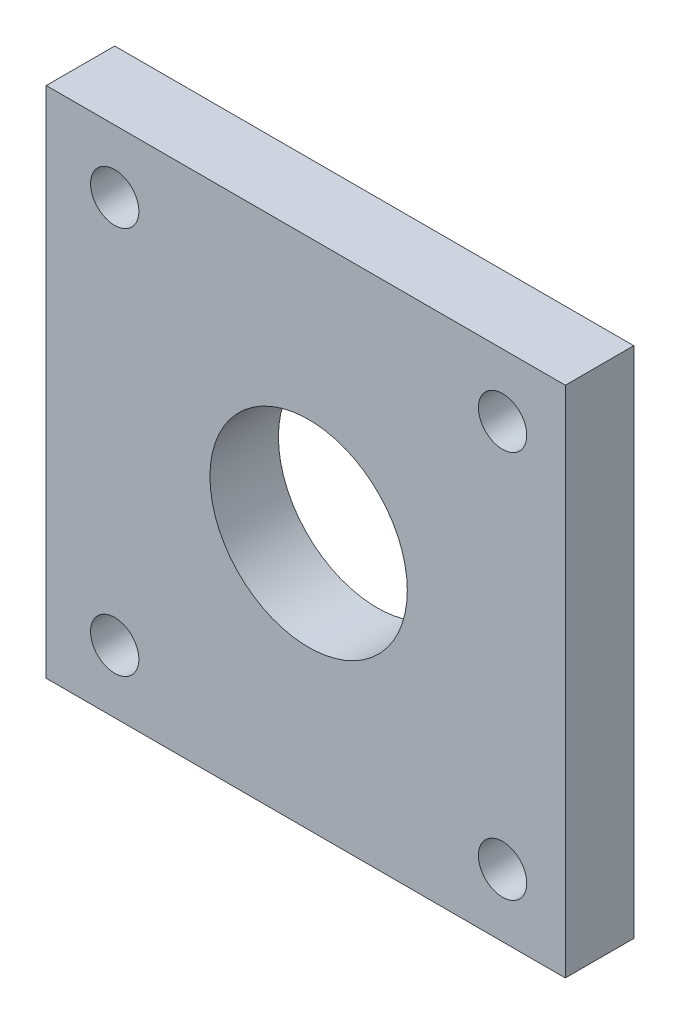
ISO-10303-21;
HEADER;
FILE_DESCRIPTION(('STEP AP214'),'2;1');
FILE_NAME('part.step','',(''),(''),'','','');
FILE_SCHEMA(('AUTOMOTIVE_DESIGN { 1 0 10303 214 1 1 1 1 }'));
ENDSEC;
DATA;
#1=APPLICATION_CONTEXT('core data for automotive mechanical design processes');
#2=APPLICATION_PROTOCOL_DEFINITION('international standard','automotive_design',2000,#1);
#3=PRODUCT_CONTEXT('',#1,'mechanical');
#4=PRODUCT('Part','Part','',(#3));
#5=PRODUCT_RELATED_PRODUCT_CATEGORY('part','',(#4));
#6=PRODUCT_DEFINITION_FORMATION('','',#4);
#7=PRODUCT_DEFINITION_CONTEXT('part definition',#1,'design');
#8=PRODUCT_DEFINITION('design','',#6,#7);
#9=PRODUCT_DEFINITION_SHAPE('','',#8);
#10=(LENGTH_UNIT() NAMED_UNIT(*) SI_UNIT(.MILLI.,.METRE.));
#11=(NAMED_UNIT(*) PLANE_ANGLE_UNIT() SI_UNIT($,.RADIAN.));
#12=(NAMED_UNIT(*) SI_UNIT($,.STERADIAN.) SOLID_ANGLE_UNIT());
#13=UNCERTAINTY_MEASURE_WITH_UNIT(LENGTH_MEASURE(1.E-05),#10,'distance_accuracy_value','');
#14=(GEOMETRIC_REPRESENTATION_CONTEXT(3) GLOBAL_UNCERTAINTY_ASSIGNED_CONTEXT((#13)) GLOBAL_UNIT_ASSIGNED_CONTEXT((#10,
#11,#12)) REPRESENTATION_CONTEXT('',''));
#15=CARTESIAN_POINT('',(0.,0.,0.));
#16=DIRECTION('',(0.,0.,1.));
#17=DIRECTION('',(1.,0.,0.));
#18=AXIS2_PLACEMENT_3D('',#15,#16,#17);
#19=CARTESIAN_POINT('',(0.,0.,6.));
#20=DIRECTION('',(0.,0.,1.));
#21=DIRECTION('',(1.,0.,0.));
#22=AXIS2_PLACEMENT_3D('',#19,#20,#21);
#23=PLANE('',#22);
#24=CARTESIAN_POINT('',(17.,-17.,6.));
#25=DIRECTION('',(0.,0.,1.));
#26=DIRECTION('',(1.,0.,0.));
#27=AXIS2_PLACEMENT_3D('',#24,#25,#26);
#28=CIRCLE('',#27,2.12);
#29=CARTESIAN_POINT('',(19.12,-17.,6.));
#30=VERTEX_POINT('',#29);
#31=EDGE_CURVE('E133',#30,#30,#28,.T.);
#32=ORIENTED_EDGE('',*,*,#31,.F.);
#33=EDGE_LOOP('',(#32));
#34=FACE_BOUND('',#33,.T.);
#35=CARTESIAN_POINT('',(-17.,-17.,6.));
#36=DIRECTION('',(0.,0.,1.));
#37=DIRECTION('',(1.,0.,0.));
#38=AXIS2_PLACEMENT_3D('',#35,#36,#37);
#39=CIRCLE('',#38,2.12);
#40=CARTESIAN_POINT('',(-14.88,-17.,6.));
#41=VERTEX_POINT('',#40);
#42=EDGE_CURVE('E122',#41,#41,#39,.T.);
#43=ORIENTED_EDGE('',*,*,#42,.F.);
#44=EDGE_LOOP('',(#43));
#45=FACE_BOUND('',#44,.T.);
#46=DIRECTION('',(0.,-1.,0.));
#47=VECTOR('',#46,1.);
#48=CARTESIAN_POINT('',(-23.,22.5,6.));
#49=LINE('',#48,#47);
#50=CARTESIAN_POINT('',(-23.,22.5,6.));
#51=VERTEX_POINT('',#50);
#52=CARTESIAN_POINT('',(-23.,-22.5,6.));
#53=VERTEX_POINT('',#52);
#54=EDGE_CURVE('E92',#51,#53,#49,.T.);
#55=ORIENTED_EDGE('',*,*,#54,.T.);
#56=DIRECTION('',(1.,0.,0.));
#57=VECTOR('',#56,1.);
#58=CARTESIAN_POINT('',(-23.,-22.5,6.));
#59=LINE('',#58,#57);
#60=CARTESIAN_POINT('',(22.5,-22.5,6.));
#61=VERTEX_POINT('',#60);
#62=EDGE_CURVE('E86',#53,#61,#59,.T.);
#63=ORIENTED_EDGE('',*,*,#62,.T.);
#64=DIRECTION('',(0.,1.,0.));
#65=VECTOR('',#64,1.);
#66=CARTESIAN_POINT('',(22.5,-22.5,6.));
#67=LINE('',#66,#65);
#68=CARTESIAN_POINT('',(22.5,22.5,6.));
#69=VERTEX_POINT('',#68);
#70=EDGE_CURVE('E87',#61,#69,#67,.T.);
#71=ORIENTED_EDGE('',*,*,#70,.T.);
#72=DIRECTION('',(-1.,0.,0.));
#73=VECTOR('',#72,1.);
#74=CARTESIAN_POINT('',(22.5,22.5,6.));
#75=LINE('',#74,#73);
#76=EDGE_CURVE('E57',#69,#51,#75,.T.);
#77=ORIENTED_EDGE('',*,*,#76,.T.);
#78=EDGE_LOOP('',(#55,#63,#71,#77));
#79=FACE_BOUND('',#78,.T.);
#80=CARTESIAN_POINT('',(0.,0.,6.));
#81=DIRECTION('',(0.,0.,1.));
#82=DIRECTION('',(1.,0.,0.));
#83=AXIS2_PLACEMENT_3D('',#80,#81,#82);
#84=CIRCLE('',#83,8.65);
#85=CARTESIAN_POINT('',(8.65,0.,6.));
#86=VERTEX_POINT('',#85);
#87=EDGE_CURVE('E106',#86,#86,#84,.T.);
#88=ORIENTED_EDGE('',*,*,#87,.F.);
#89=EDGE_LOOP('',(#88));
#90=FACE_BOUND('',#89,.T.);
#91=CARTESIAN_POINT('',(-17.,17.,6.));
#92=DIRECTION('',(0.,0.,1.));
#93=DIRECTION('',(1.,0.,0.));
#94=AXIS2_PLACEMENT_3D('',#91,#92,#93);
#95=CIRCLE('',#94,2.12);
#96=CARTESIAN_POINT('',(-14.88,17.,6.));
#97=VERTEX_POINT('',#96);
#98=EDGE_CURVE('E127',#97,#97,#95,.T.);
#99=ORIENTED_EDGE('',*,*,#98,.F.);
#100=EDGE_LOOP('',(#99));
#101=FACE_BOUND('',#100,.T.);
#102=CARTESIAN_POINT('',(17.,17.,6.));
#103=DIRECTION('',(0.,0.,1.));
#104=DIRECTION('',(1.,0.,0.));
#105=AXIS2_PLACEMENT_3D('',#102,#103,#104);
#106=CIRCLE('',#105,2.12);
#107=CARTESIAN_POINT('',(19.12,17.,6.));
#108=VERTEX_POINT('',#107);
#109=EDGE_CURVE('E136',#108,#108,#106,.T.);
#110=ORIENTED_EDGE('',*,*,#109,.F.);
#111=EDGE_LOOP('',(#110));
#112=FACE_BOUND('',#111,.T.);
#113=ADVANCED_FACE('F39',(#34,#45,#79,#90,#101,#112),#23,.T.);
#114=CARTESIAN_POINT('',(0.,0.,0.));
#115=DIRECTION('',(0.,0.,1.));
#116=DIRECTION('',(1.,0.,0.));
#117=AXIS2_PLACEMENT_3D('',#114,#115,#116);
#118=PLANE('',#117);
#119=DIRECTION('',(0.,-1.,0.));
#120=VECTOR('',#119,1.);
#121=CARTESIAN_POINT('',(-23.,22.5,0.));
#122=LINE('',#121,#120);
#123=CARTESIAN_POINT('',(-23.,22.5,0.));
#124=VERTEX_POINT('',#123);
#125=CARTESIAN_POINT('',(-23.,-22.5,0.));
#126=VERTEX_POINT('',#125);
#127=EDGE_CURVE('E101',#124,#126,#122,.T.);
#128=ORIENTED_EDGE('',*,*,#127,.F.);
#129=DIRECTION('',(-1.,0.,0.));
#130=VECTOR('',#129,1.);
#131=CARTESIAN_POINT('',(22.5,22.5,0.));
#132=LINE('',#131,#130);
#133=CARTESIAN_POINT('',(22.5,22.5,0.));
#134=VERTEX_POINT('',#133);
#135=EDGE_CURVE('E79',#134,#124,#132,.T.);
#136=ORIENTED_EDGE('',*,*,#135,.F.);
#137=DIRECTION('',(0.,1.,0.));
#138=VECTOR('',#137,1.);
#139=CARTESIAN_POINT('',(22.5,-22.5,0.));
#140=LINE('',#139,#138);
#141=CARTESIAN_POINT('',(22.5,-22.5,0.));
#142=VERTEX_POINT('',#141);
#143=EDGE_CURVE('E74',#142,#134,#140,.T.);
#144=ORIENTED_EDGE('',*,*,#143,.F.);
#145=DIRECTION('',(1.,0.,0.));
#146=VECTOR('',#145,1.);
#147=CARTESIAN_POINT('',(-23.,-22.5,0.));
#148=LINE('',#147,#146);
#149=EDGE_CURVE('E93',#126,#142,#148,.T.);
#150=ORIENTED_EDGE('',*,*,#149,.F.);
#151=EDGE_LOOP('',(#128,#136,#144,#150));
#152=FACE_BOUND('',#151,.T.);
#153=CARTESIAN_POINT('',(0.,0.,0.));
#154=DIRECTION('',(0.,0.,1.));
#155=DIRECTION('',(1.,0.,0.));
#156=AXIS2_PLACEMENT_3D('',#153,#154,#155);
#157=CIRCLE('',#156,8.65);
#158=CARTESIAN_POINT('',(8.65,0.,0.));
#159=VERTEX_POINT('',#158);
#160=EDGE_CURVE('E117',#159,#159,#157,.T.);
#161=ORIENTED_EDGE('',*,*,#160,.T.);
#162=EDGE_LOOP('',(#161));
#163=FACE_BOUND('',#162,.T.);
#164=CARTESIAN_POINT('',(-17.,-17.,0.));
#165=DIRECTION('',(0.,0.,1.));
#166=DIRECTION('',(1.,0.,0.));
#167=AXIS2_PLACEMENT_3D('',#164,#165,#166);
#168=CIRCLE('',#167,2.12);
#169=CARTESIAN_POINT('',(-14.88,-17.,0.));
#170=VERTEX_POINT('',#169);
#171=EDGE_CURVE('E121',#170,#170,#168,.T.);
#172=ORIENTED_EDGE('',*,*,#171,.T.);
#173=EDGE_LOOP('',(#172));
#174=FACE_BOUND('',#173,.T.);
#175=CARTESIAN_POINT('',(-17.,17.,0.));
#176=DIRECTION('',(0.,0.,1.));
#177=DIRECTION('',(1.,0.,0.));
#178=AXIS2_PLACEMENT_3D('',#175,#176,#177);
#179=CIRCLE('',#178,2.12);
#180=CARTESIAN_POINT('',(-14.88,17.,0.));
#181=VERTEX_POINT('',#180);
#182=EDGE_CURVE('E130',#181,#181,#179,.T.);
#183=ORIENTED_EDGE('',*,*,#182,.T.);
#184=EDGE_LOOP('',(#183));
#185=FACE_BOUND('',#184,.T.);
#186=CARTESIAN_POINT('',(17.,-17.,0.));
#187=DIRECTION('',(0.,0.,1.));
#188=DIRECTION('',(1.,0.,0.));
#189=AXIS2_PLACEMENT_3D('',#186,#187,#188);
#190=CIRCLE('',#189,2.12);
#191=CARTESIAN_POINT('',(19.12,-17.,0.));
#192=VERTEX_POINT('',#191);
#193=EDGE_CURVE('E137',#192,#192,#190,.T.);
#194=ORIENTED_EDGE('',*,*,#193,.T.);
#195=EDGE_LOOP('',(#194));
#196=FACE_BOUND('',#195,.T.);
#197=CARTESIAN_POINT('',(17.,17.,0.));
#198=DIRECTION('',(0.,0.,1.));
#199=DIRECTION('',(1.,0.,0.));
#200=AXIS2_PLACEMENT_3D('',#197,#198,#199);
#201=CIRCLE('',#200,2.12);
#202=CARTESIAN_POINT('',(19.12,17.,0.));
#203=VERTEX_POINT('',#202);
#204=EDGE_CURVE('E145',#203,#203,#201,.T.);
#205=ORIENTED_EDGE('',*,*,#204,.T.);
#206=EDGE_LOOP('',(#205));
#207=FACE_BOUND('',#206,.T.);
#208=ADVANCED_FACE('F112',(#152,#163,#174,#185,#196,#207),#118,.F.);
#209=CARTESIAN_POINT('',(-23.,22.5,6.));
#210=DIRECTION('',(1.,0.,0.));
#211=DIRECTION('',(0.,0.,-1.));
#212=AXIS2_PLACEMENT_3D('',#209,#210,#211);
#213=PLANE('',#212);
#214=CARTESIAN_POINT('',(-23.,-9.,3.));
#215=DIRECTION('',(1.,0.,0.));
#216=DIRECTION('',(0.,0.,-1.));
#217=AXIS2_PLACEMENT_3D('',#214,#215,#216);
#218=CIRCLE('',#217,2.12);
#219=CARTESIAN_POINT('',(-23.,-9.,0.88));
#220=VERTEX_POINT('',#219);
#221=EDGE_CURVE('E152',#220,#220,#218,.T.);
#222=ORIENTED_EDGE('',*,*,#221,.T.);
#223=EDGE_LOOP('',(#222));
#224=FACE_BOUND('',#223,.T.);
#225=CARTESIAN_POINT('',(-23.,9.,3.));
#226=DIRECTION('',(1.,0.,0.));
#227=DIRECTION('',(0.,0.,-1.));
#228=AXIS2_PLACEMENT_3D('',#225,#226,#227);
#229=CIRCLE('',#228,2.12);
#230=CARTESIAN_POINT('',(-23.,9.,0.88));
#231=VERTEX_POINT('',#230);
#232=EDGE_CURVE('E151',#231,#231,#229,.T.);
#233=ORIENTED_EDGE('',*,*,#232,.T.);
#234=EDGE_LOOP('',(#233));
#235=FACE_BOUND('',#234,.T.);
#236=ORIENTED_EDGE('',*,*,#127,.T.);
#237=DIRECTION('',(0.,0.,-1.));
#238=VECTOR('',#237,1.);
#239=CARTESIAN_POINT('',(-23.,-22.5,6.));
#240=LINE('',#239,#238);
#241=EDGE_CURVE('E11',#53,#126,#240,.T.);
#242=ORIENTED_EDGE('',*,*,#241,.F.);
#243=ORIENTED_EDGE('',*,*,#54,.F.);
#244=DIRECTION('',(0.,0.,-1.));
#245=VECTOR('',#244,1.);
#246=CARTESIAN_POINT('',(-23.,22.5,6.));
#247=LINE('',#246,#245);
#248=EDGE_CURVE('E100',#51,#124,#247,.T.);
#249=ORIENTED_EDGE('',*,*,#248,.T.);
#250=EDGE_LOOP('',(#236,#242,#243,#249));
#251=FACE_BOUND('',#250,.T.);
#252=ADVANCED_FACE('F41',(#224,#235,#251),#213,.F.);
#253=CARTESIAN_POINT('',(-23.,-22.5,6.));
#254=DIRECTION('',(0.,1.,0.));
#255=DIRECTION('',(0.,0.,1.));
#256=AXIS2_PLACEMENT_3D('',#253,#254,#255);
#257=PLANE('',#256);
#258=ORIENTED_EDGE('',*,*,#149,.T.);
#259=DIRECTION('',(0.,0.,-1.));
#260=VECTOR('',#259,1.);
#261=CARTESIAN_POINT('',(22.5,-22.5,6.));
#262=LINE('',#261,#260);
#263=EDGE_CURVE('E48',#61,#142,#262,.T.);
#264=ORIENTED_EDGE('',*,*,#263,.F.);
#265=ORIENTED_EDGE('',*,*,#62,.F.);
#266=ORIENTED_EDGE('',*,*,#241,.T.);
#267=EDGE_LOOP('',(#258,#264,#265,#266));
#268=FACE_BOUND('',#267,.T.);
#269=ADVANCED_FACE('F91',(#268),#257,.F.);
#270=CARTESIAN_POINT('',(22.5,-22.5,6.));
#271=DIRECTION('',(-1.,0.,0.));
#272=DIRECTION('',(0.,0.,1.));
#273=AXIS2_PLACEMENT_3D('',#270,#271,#272);
#274=PLANE('',#273);
#275=ORIENTED_EDGE('',*,*,#143,.T.);
#276=DIRECTION('',(0.,0.,-1.));
#277=VECTOR('',#276,1.);
#278=CARTESIAN_POINT('',(22.5,22.5,6.));
#279=LINE('',#278,#277);
#280=EDGE_CURVE('E98',#69,#134,#279,.T.);
#281=ORIENTED_EDGE('',*,*,#280,.F.);
#282=ORIENTED_EDGE('',*,*,#70,.F.);
#283=ORIENTED_EDGE('',*,*,#263,.T.);
#284=EDGE_LOOP('',(#275,#281,#282,#283));
#285=FACE_BOUND('',#284,.T.);
#286=ADVANCED_FACE('F97',(#285),#274,.F.);
#287=CARTESIAN_POINT('',(22.5,22.5,6.));
#288=DIRECTION('',(0.,-1.,0.));
#289=DIRECTION('',(0.,0.,-1.));
#290=AXIS2_PLACEMENT_3D('',#287,#288,#289);
#291=PLANE('',#290);
#292=ORIENTED_EDGE('',*,*,#135,.T.);
#293=ORIENTED_EDGE('',*,*,#248,.F.);
#294=ORIENTED_EDGE('',*,*,#76,.F.);
#295=ORIENTED_EDGE('',*,*,#280,.T.);
#296=EDGE_LOOP('',(#292,#293,#294,#295));
#297=FACE_BOUND('',#296,.T.);
#298=ADVANCED_FACE('F111',(#297),#291,.F.);
#299=CARTESIAN_POINT('',(0.,0.,6.));
#300=DIRECTION('',(0.,0.,-1.));
#301=DIRECTION('',(-1.,0.,0.));
#302=AXIS2_PLACEMENT_3D('',#299,#300,#301);
#303=CYLINDRICAL_SURFACE('',#302,8.65);
#304=ORIENTED_EDGE('',*,*,#87,.T.);
#305=EDGE_LOOP('',(#304));
#306=FACE_BOUND('',#305,.T.);
#307=ORIENTED_EDGE('',*,*,#160,.F.);
#308=EDGE_LOOP('',(#307));
#309=FACE_BOUND('',#308,.T.);
#310=ADVANCED_FACE('F181',(#306,#309),#303,.F.);
#311=CARTESIAN_POINT('',(-17.,-17.,6.));
#312=DIRECTION('',(0.,0.,-1.));
#313=DIRECTION('',(-1.,0.,0.));
#314=AXIS2_PLACEMENT_3D('',#311,#312,#313);
#315=CYLINDRICAL_SURFACE('',#314,2.12);
#316=ORIENTED_EDGE('',*,*,#42,.T.);
#317=EDGE_LOOP('',(#316));
#318=FACE_BOUND('',#317,.T.);
#319=ORIENTED_EDGE('',*,*,#171,.F.);
#320=EDGE_LOOP('',(#319));
#321=FACE_BOUND('',#320,.T.);
#322=ADVANCED_FACE('F218',(#318,#321),#315,.F.);
#323=CARTESIAN_POINT('',(-17.,17.,6.));
#324=DIRECTION('',(0.,0.,-1.));
#325=DIRECTION('',(-1.,0.,0.));
#326=AXIS2_PLACEMENT_3D('',#323,#324,#325);
#327=CYLINDRICAL_SURFACE('',#326,2.12);
#328=ORIENTED_EDGE('',*,*,#98,.T.);
#329=EDGE_LOOP('',(#328));
#330=FACE_BOUND('',#329,.T.);
#331=ORIENTED_EDGE('',*,*,#182,.F.);
#332=EDGE_LOOP('',(#331));
#333=FACE_BOUND('',#332,.T.);
#334=ADVANCED_FACE('F215',(#330,#333),#327,.F.);
#335=CARTESIAN_POINT('',(17.,-17.,6.));
#336=DIRECTION('',(0.,0.,-1.));
#337=DIRECTION('',(-1.,0.,0.));
#338=AXIS2_PLACEMENT_3D('',#335,#336,#337);
#339=CYLINDRICAL_SURFACE('',#338,2.12);
#340=ORIENTED_EDGE('',*,*,#31,.T.);
#341=EDGE_LOOP('',(#340));
#342=FACE_BOUND('',#341,.T.);
#343=ORIENTED_EDGE('',*,*,#193,.F.);
#344=EDGE_LOOP('',(#343));
#345=FACE_BOUND('',#344,.T.);
#346=ADVANCED_FACE('F209',(#342,#345),#339,.F.);
#347=CARTESIAN_POINT('',(17.,17.,6.));
#348=DIRECTION('',(0.,0.,-1.));
#349=DIRECTION('',(-1.,0.,0.));
#350=AXIS2_PLACEMENT_3D('',#347,#348,#349);
#351=CYLINDRICAL_SURFACE('',#350,2.12);
#352=ORIENTED_EDGE('',*,*,#109,.T.);
#353=EDGE_LOOP('',(#352));
#354=FACE_BOUND('',#353,.T.);
#355=ORIENTED_EDGE('',*,*,#204,.F.);
#356=EDGE_LOOP('',(#355));
#357=FACE_BOUND('',#356,.T.);
#358=ADVANCED_FACE('F202',(#354,#357),#351,.F.);
#359=CARTESIAN_POINT('',(-16.,9.,3.));
#360=DIRECTION('',(-1.,0.,0.));
#361=DIRECTION('',(0.,0.,1.));
#362=AXIS2_PLACEMENT_3D('',#359,#360,#361);
#363=CYLINDRICAL_SURFACE('',#362,2.12);
#364=CARTESIAN_POINT('',(-16.,9.,3.));
#365=DIRECTION('',(1.,0.,0.));
#366=DIRECTION('',(0.,0.,-1.));
#367=AXIS2_PLACEMENT_3D('',#364,#365,#366);
#368=CIRCLE('',#367,2.12);
#369=CARTESIAN_POINT('',(-16.,9.,0.88));
#370=VERTEX_POINT('',#369);
#371=EDGE_CURVE('E149',#370,#370,#368,.T.);
#372=ORIENTED_EDGE('',*,*,#371,.T.);
#373=EDGE_LOOP('',(#372));
#374=FACE_BOUND('',#373,.T.);
#375=ORIENTED_EDGE('',*,*,#232,.F.);
#376=EDGE_LOOP('',(#375));
#377=FACE_BOUND('',#376,.T.);
#378=ADVANCED_FACE('F199',(#374,#377),#363,.F.);
#379=CARTESIAN_POINT('',(-16.,9.,3.));
#380=DIRECTION('',(1.,0.,0.));
#381=DIRECTION('',(0.,0.,-1.));
#382=AXIS2_PLACEMENT_3D('',#379,#380,#381);
#383=PLANE('',#382);
#384=ORIENTED_EDGE('',*,*,#371,.F.);
#385=EDGE_LOOP('',(#384));
#386=FACE_BOUND('',#385,.T.);
#387=ADVANCED_FACE('F169',(#386),#383,.F.);
#388=CARTESIAN_POINT('',(-16.,-9.,3.));
#389=DIRECTION('',(-1.,0.,0.));
#390=DIRECTION('',(0.,0.,1.));
#391=AXIS2_PLACEMENT_3D('',#388,#389,#390);
#392=CYLINDRICAL_SURFACE('',#391,2.12);
#393=CARTESIAN_POINT('',(-16.,-9.,3.));
#394=DIRECTION('',(1.,0.,0.));
#395=DIRECTION('',(0.,0.,-1.));
#396=AXIS2_PLACEMENT_3D('',#393,#394,#395);
#397=CIRCLE('',#396,2.12);
#398=CARTESIAN_POINT('',(-16.,-9.,0.88));
#399=VERTEX_POINT('',#398);
#400=EDGE_CURVE('E143',#399,#399,#397,.T.);
#401=ORIENTED_EDGE('',*,*,#400,.T.);
#402=EDGE_LOOP('',(#401));
#403=FACE_BOUND('',#402,.T.);
#404=ORIENTED_EDGE('',*,*,#221,.F.);
#405=EDGE_LOOP('',(#404));
#406=FACE_BOUND('',#405,.T.);
#407=ADVANCED_FACE('F158',(#403,#406),#392,.F.);
#408=CARTESIAN_POINT('',(-16.,-9.,3.));
#409=DIRECTION('',(1.,0.,0.));
#410=DIRECTION('',(0.,0.,-1.));
#411=AXIS2_PLACEMENT_3D('',#408,#409,#410);
#412=PLANE('',#411);
#413=ORIENTED_EDGE('',*,*,#400,.F.);
#414=EDGE_LOOP('',(#413));
#415=FACE_BOUND('',#414,.T.);
#416=ADVANCED_FACE('F161',(#415),#412,.F.);
#417=CLOSED_SHELL('',(#113,#208,#252,#269,#286,#298,#310,#322,#334,#346,#358,#378,#387,#407,#416));
#418=MANIFOLD_SOLID_BREP('B2',#417);
#419=ADVANCED_BREP_SHAPE_REPRESENTATION('',(#18,#418),#14);
#420=SHAPE_DEFINITION_REPRESENTATION(#9,#419);
ENDSEC;
END-ISO-10303-21;
